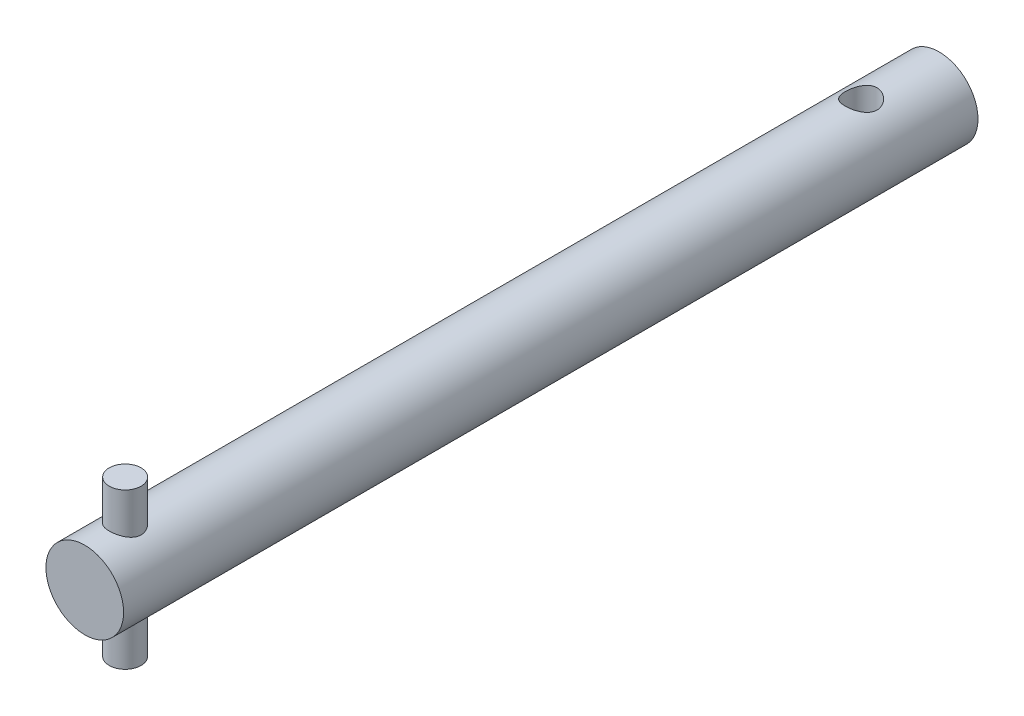
ISO-10303-21;
HEADER;
FILE_DESCRIPTION(('STEP AP214'),'2;1');
FILE_NAME('part.step','',(''),(''),'','','');
FILE_SCHEMA(('AUTOMOTIVE_DESIGN { 1 0 10303 214 1 1 1 1 }'));
ENDSEC;
DATA;
#1=APPLICATION_CONTEXT('core data for automotive mechanical design processes');
#2=APPLICATION_PROTOCOL_DEFINITION('international standard','automotive_design',2000,#1);
#3=PRODUCT_CONTEXT('',#1,'mechanical');
#4=PRODUCT('Part','Part','',(#3));
#5=PRODUCT_RELATED_PRODUCT_CATEGORY('part','',(#4));
#6=PRODUCT_DEFINITION_FORMATION('','',#4);
#7=PRODUCT_DEFINITION_CONTEXT('part definition',#1,'design');
#8=PRODUCT_DEFINITION('design','',#6,#7);
#9=PRODUCT_DEFINITION_SHAPE('','',#8);
#10=(LENGTH_UNIT() NAMED_UNIT(*) SI_UNIT(.MILLI.,.METRE.));
#11=(NAMED_UNIT(*) PLANE_ANGLE_UNIT() SI_UNIT($,.RADIAN.));
#12=(NAMED_UNIT(*) SI_UNIT($,.STERADIAN.) SOLID_ANGLE_UNIT());
#13=UNCERTAINTY_MEASURE_WITH_UNIT(LENGTH_MEASURE(1.E-05),#10,'distance_accuracy_value','');
#14=(GEOMETRIC_REPRESENTATION_CONTEXT(3) GLOBAL_UNCERTAINTY_ASSIGNED_CONTEXT((#13)) GLOBAL_UNIT_ASSIGNED_CONTEXT((#10,
#11,#12)) REPRESENTATION_CONTEXT('',''));
#15=CARTESIAN_POINT('',(0.,0.,0.));
#16=DIRECTION('',(0.,0.,1.));
#17=DIRECTION('',(1.,0.,0.));
#18=AXIS2_PLACEMENT_3D('',#15,#16,#17);
#19=CARTESIAN_POINT('',(0.,-20.,209.6));
#20=DIRECTION('',(0.,1.,0.));
#21=DIRECTION('',(0.,0.,1.));
#22=AXIS2_PLACEMENT_3D('',#19,#20,#21);
#23=CYLINDRICAL_SURFACE('',#22,4.09999999999999);
#24=CARTESIAN_POINT('',(0.,-20.,209.6));
#25=DIRECTION('',(0.,1.,0.));
#26=DIRECTION('',(0.,0.,1.));
#27=AXIS2_PLACEMENT_3D('',#24,#25,#26);
#28=CIRCLE('',#27,4.09999999999999);
#29=CARTESIAN_POINT('',(0.,-20.,213.7));
#30=VERTEX_POINT('',#29);
#31=EDGE_CURVE('E11',#30,#30,#28,.T.);
#32=ORIENTED_EDGE('',*,*,#31,.T.);
#33=EDGE_LOOP('',(#32));
#34=FACE_BOUND('',#33,.T.);
#35=CARTESIAN_POINT('',(0.,20.,209.6));
#36=DIRECTION('',(0.,1.,0.));
#37=DIRECTION('',(0.,0.,1.));
#38=AXIS2_PLACEMENT_3D('',#35,#36,#37);
#39=CIRCLE('',#38,4.09999999999999);
#40=CARTESIAN_POINT('',(0.,20.,213.7));
#41=VERTEX_POINT('',#40);
#42=EDGE_CURVE('E51',#41,#41,#39,.T.);
#43=ORIENTED_EDGE('',*,*,#42,.F.);
#44=EDGE_LOOP('',(#43));
#45=FACE_BOUND('',#44,.T.);
#46=ADVANCED_FACE('F45',(#34,#45),#23,.T.);
#47=CARTESIAN_POINT('',(0.,-20.,209.6));
#48=DIRECTION('',(0.,1.,0.));
#49=DIRECTION('',(0.,0.,1.));
#50=AXIS2_PLACEMENT_3D('',#47,#48,#49);
#51=PLANE('',#50);
#52=ORIENTED_EDGE('',*,*,#31,.F.);
#53=EDGE_LOOP('',(#52));
#54=FACE_BOUND('',#53,.T.);
#55=ADVANCED_FACE('F60',(#54),#51,.F.);
#56=CARTESIAN_POINT('',(0.,20.,209.6));
#57=DIRECTION('',(0.,1.,0.));
#58=DIRECTION('',(0.,0.,1.));
#59=AXIS2_PLACEMENT_3D('',#56,#57,#58);
#60=PLANE('',#59);
#61=ORIENTED_EDGE('',*,*,#42,.T.);
#62=EDGE_LOOP('',(#61));
#63=FACE_BOUND('',#62,.T.);
#64=ADVANCED_FACE('F57',(#63),#60,.T.);
#65=CLOSED_SHELL('',(#46,#55,#64));
#66=MANIFOLD_SOLID_BREP('B2',#65);
#67=CARTESIAN_POINT('',(0.,-1.11022302462516E-13,220.));
#68=DIRECTION('',(0.,0.,-1.));
#69=DIRECTION('',(-1.,0.,0.));
#70=AXIS2_PLACEMENT_3D('',#67,#68,#69);
#71=CYLINDRICAL_SURFACE('',#70,10.);
#72=CARTESIAN_POINT('',(0.,-10.,213.7));
#73=CARTESIAN_POINT('',(0.110007668732809,-9.99999942379567,213.69999926161));
#74=CARTESIAN_POINT('',(0.220054988478904,-9.99817960761471,213.695566248649));
#75=CARTESIAN_POINT('',(0.439366410277717,-9.99094652228085,213.677876320665));
#76=CARTESIAN_POINT('',(0.548629959334115,-9.98553092819759,213.664613696646));
#77=CARTESIAN_POINT('',(0.765755400161891,-9.97123211489997,213.629358822963));
#78=CARTESIAN_POINT('',(0.873613875429744,-9.96234165390743,213.607348340746));
#79=CARTESIAN_POINT('',(1.08693380274593,-9.9413327010413,213.554828046351));
#80=CARTESIAN_POINT('',(1.19239425608763,-9.92921289002551,213.524314760669));
#81=CARTESIAN_POINT('',(1.50329741822684,-9.88855374555773,213.420680225517));
#82=CARTESIAN_POINT('',(1.70423712669612,-9.8556463269752,213.335303412618));
#83=CARTESIAN_POINT('',(2.08865332920931,-9.78141001821997,213.134770997763));
#84=CARTESIAN_POINT('',(2.27213539766647,-9.74008382958069,213.019624945399));
#85=CARTESIAN_POINT('',(2.62580879886722,-9.65089874629261,212.756866165659));
#86=CARTESIAN_POINT('',(2.79503948848893,-9.60283041948107,212.608032299706));
#87=CARTESIAN_POINT('',(3.10701103752561,-9.50648143724177,212.284576905152));
#88=CARTESIAN_POINT('',(3.24973835496845,-9.45820068610163,212.109942274955));
#89=CARTESIAN_POINT('',(3.44426522745151,-9.38840255537039,211.827328129702));
#90=CARTESIAN_POINT('',(3.50701876973873,-9.36508038932406,211.727164508854));
#91=CARTESIAN_POINT('',(3.62380746819969,-9.3205107752373,211.52145466053));
#92=CARTESIAN_POINT('',(3.67784616776476,-9.29926248536838,211.415910643773));
#93=CARTESIAN_POINT('',(3.77674187996859,-9.25953912100863,211.200098290606));
#94=CARTESIAN_POINT('',(3.82159843195302,-9.24106418566515,211.089829717506));
#95=CARTESIAN_POINT('',(3.90166255463828,-9.20754659496636,210.865390734828));
#96=CARTESIAN_POINT('',(3.93687503412385,-9.19250219414143,210.751222343645));
#97=CARTESIAN_POINT('',(3.9958704079158,-9.16700629662939,210.525212273466));
#98=CARTESIAN_POINT('',(4.02010949068872,-9.15637342640527,210.413510129735));
#99=CARTESIAN_POINT('',(4.05919515609124,-9.13911335116285,210.188216102067));
#100=CARTESIAN_POINT('',(4.07404603888867,-9.13248431229317,210.074625107805));
#101=CARTESIAN_POINT('',(4.09418760517084,-9.12347250009092,209.846456813326));
#102=CARTESIAN_POINT('',(4.09948056998859,-9.12108871348159,209.73187975503));
#103=CARTESIAN_POINT('',(4.10044659531372,-9.12065447315865,209.502681548584));
#104=CARTESIAN_POINT('',(4.09612013835093,-9.12260380208712,209.388060402934));
#105=CARTESIAN_POINT('',(4.07857649864668,-9.13045992824223,209.168194861106));
#106=CARTESIAN_POINT('',(4.06604157482803,-9.13606290714635,209.062884771631));
#107=CARTESIAN_POINT('',(4.03291134125425,-9.15073456148362,208.853775182038));
#108=CARTESIAN_POINT('',(4.01231338845931,-9.15980437331257,208.749976188838));
#109=CARTESIAN_POINT('',(3.93870485151611,-9.19181971746231,208.441954446817));
#110=CARTESIAN_POINT('',(3.8738645638552,-9.2195784551596,208.240923164617));
#111=CARTESIAN_POINT('',(3.71328039262521,-9.28542712109565,207.848569730994));
#112=CARTESIAN_POINT('',(3.61691769214167,-9.32372125402804,207.657539119383));
#113=CARTESIAN_POINT('',(3.39644169708573,-9.40627581120766,207.293603377262));
#114=CARTESIAN_POINT('',(3.27231766126441,-9.45053854214957,207.12070530062));
#115=CARTESIAN_POINT('',(2.98795406810723,-9.54443785545721,206.783136047438));
#116=CARTESIAN_POINT('',(2.82559427398738,-9.59421825330542,206.620286743321));
#117=CARTESIAN_POINT('',(2.47535965100174,-9.69048779775721,206.323525320989));
#118=CARTESIAN_POINT('',(2.28747923080463,-9.73697621971453,206.189619560741));
#119=CARTESIAN_POINT('',(1.88615207259607,-9.82269704957375,205.951993562876));
#120=CARTESIAN_POINT('',(1.67223893521033,-9.86175006774089,205.848991574045));
#121=CARTESIAN_POINT('',(1.22811223659015,-9.92683156974756,205.681069497968));
#122=CARTESIAN_POINT('',(0.99790746343843,-9.95286701534867,205.616129052307));
#123=CARTESIAN_POINT('',(0.542970639598998,-9.98769220218834,205.529933427289));
#124=CARTESIAN_POINT('',(0.318775553924434,-9.99744582843961,205.506232784849));
#125=CARTESIAN_POINT('',(-0.130580777276464,-10.0016687207947,205.495927088334));
#126=CARTESIAN_POINT('',(-0.355741739402709,-9.99614219989587,205.509311809193));
#127=CARTESIAN_POINT('',(-0.789335598166546,-9.97105346913116,205.571026356622));
#128=CARTESIAN_POINT('',(-0.998054052575001,-9.95217353349491,205.61765835647));
#129=CARTESIAN_POINT('',(-1.40449144493457,-9.90299645178983,205.742202924269));
#130=CARTESIAN_POINT('',(-1.60220897934548,-9.87269785269928,205.820119473251));
#131=CARTESIAN_POINT('',(-1.98791933322146,-9.80243915194958,206.007565937328));
#132=CARTESIAN_POINT('',(-2.17542272920156,-9.76220938705181,206.117998489579));
#133=CARTESIAN_POINT('',(-2.52990690107349,-9.6764086994886,206.36635760286));
#134=CARTESIAN_POINT('',(-2.69687919054465,-9.63083558328137,206.504295471714));
#135=CARTESIAN_POINT('',(-3.01769453453923,-9.53537881978359,206.814898981451));
#136=CARTESIAN_POINT('',(-3.1698265400511,-9.4854152789938,206.989308514801));
#137=CARTESIAN_POINT('',(-3.4431649788808,-9.38965672661035,207.36215117522));
#138=CARTESIAN_POINT('',(-3.56436519846255,-9.34386255376736,207.560589117454));
#139=CARTESIAN_POINT('',(-3.72075962648743,-9.2821945375182,207.873775698942));
#140=CARTESIAN_POINT('',(-3.76889001193939,-9.26270347075246,207.981528982504));
#141=CARTESIAN_POINT('',(-3.85582088347273,-9.22685530606518,208.201223301377));
#142=CARTESIAN_POINT('',(-3.89462545467637,-9.21049683656684,208.313162478157));
#143=CARTESIAN_POINT('',(-3.96248027578092,-9.18150929486614,208.540374324066));
#144=CARTESIAN_POINT('',(-3.99153474770654,-9.16887860873128,208.655645526801));
#145=CARTESIAN_POINT('',(-4.03956904872027,-9.14781792239618,208.888645618362));
#146=CARTESIAN_POINT('',(-4.05854978270396,-9.13938754489818,209.006374285453));
#147=CARTESIAN_POINT('',(-4.08515211375237,-9.12752574179851,209.234355414812));
#148=CARTESIAN_POINT('',(-4.09352069056867,-9.1237660211122,209.344504195661));
#149=CARTESIAN_POINT('',(-4.10133990874788,-9.12025381450701,209.56522048781));
#150=CARTESIAN_POINT('',(-4.1007875616926,-9.12050267142052,209.675788127023));
#151=CARTESIAN_POINT('',(-4.09076222395259,-9.12500395642165,209.896384034903));
#152=CARTESIAN_POINT('',(-4.08129382771662,-9.12925432252747,210.006412552029));
#153=CARTESIAN_POINT('',(-4.05356196016496,-9.14160009935805,210.225150013322));
#154=CARTESIAN_POINT('',(-4.03529517383892,-9.14969695932844,210.333858444275));
#155=CARTESIAN_POINT('',(-3.96954781238333,-9.17850748268534,210.647274808126));
#156=CARTESIAN_POINT('',(-3.91061144074644,-9.20399636299515,210.849269755647));
#157=CARTESIAN_POINT('',(-3.76334149729218,-9.26517920811116,211.24044413479));
#158=CARTESIAN_POINT('',(-3.67499972037679,-9.30087602088203,211.429619971696));
#159=CARTESIAN_POINT('',(-3.4653920264463,-9.38106292063349,211.802122968797));
#160=CARTESIAN_POINT('',(-3.34249071273537,-9.42594762961904,211.984446047385));
#161=CARTESIAN_POINT('',(-3.06962571875099,-9.51830645643289,212.326792835827));
#162=CARTESIAN_POINT('',(-2.9196531414674,-9.56578142196297,212.486809183808));
#163=CARTESIAN_POINT('',(-2.58434486952391,-9.66196218121087,212.791531234237));
#164=CARTESIAN_POINT('',(-2.3972749313011,-9.71052386390146,212.934397566632));
#165=CARTESIAN_POINT('',(-2.09960427807814,-9.77763257348165,213.123572021777));
#166=CARTESIAN_POINT('',(-1.99744522049397,-9.79906179212933,213.182480813843));
#167=CARTESIAN_POINT('',(-1.78805531017716,-9.83942047506732,213.291444244485));
#168=CARTESIAN_POINT('',(-1.68082681920308,-9.85835108812636,213.341502955629));
#169=CARTESIAN_POINT('',(-1.46387782142195,-9.89287257063247,213.431530553507));
#170=CARTESIAN_POINT('',(-1.35423037364135,-9.90851461535684,213.471656097681));
#171=CARTESIAN_POINT('',(-1.13156178433277,-9.93640507095531,213.542487320185));
#172=CARTESIAN_POINT('',(-1.01854226470596,-9.9486550850856,213.573197449485));
#173=CARTESIAN_POINT('',(-0.790251734601282,-9.96938358340453,213.624818825994));
#174=CARTESIAN_POINT('',(-0.674987077293651,-9.97787144365381,213.645754440336));
#175=CARTESIAN_POINT('',(-0.442925113312001,-9.99086092366376,213.677685247012));
#176=CARTESIAN_POINT('',(-0.326129011555021,-9.99536550640742,213.688687828216));
#177=CARTESIAN_POINT('',(-0.174267574962155,-9.9985422751596,213.696443363731));
#178=CARTESIAN_POINT('',(-0.139430869289151,-9.99908865066459,213.697776766584));
#179=CARTESIAN_POINT('',(-0.0697307702130565,-9.99981760464276,213.699555202329));
#180=CARTESIAN_POINT('',(-0.034867376774405,-10.0000001826303,213.700000234036));
#181=CARTESIAN_POINT('',(0.,-10.,213.7));
#182=B_SPLINE_CURVE_WITH_KNOTS('',3,(#72,#73,#74,#75,#76,#77,#78,#79,#80,#81,#82,#83,#84,#85,
#86,#87,#88,#89,#90,#91,#92,#93,#94,#95,#96,#97,#98,#99,#100,#101,#102,#103,#104,#105,#106,#107,
#108,#109,#110,#111,#112,#113,#114,#115,#116,#117,#118,#119,#120,#121,#122,#123,#124,#125,#126,
#127,#128,#129,#130,#131,#132,#133,#134,#135,#136,#137,#138,#139,#140,#141,#142,#143,#144,#145,
#146,#147,#148,#149,#150,#151,#152,#153,#154,#155,#156,#157,#158,#159,#160,#161,#162,#163,#164,
#165,#166,#167,#168,#169,#170,#171,#172,#173,#174,#175,#176,#177,#178,#179,#180,#181),
.UNSPECIFIED.,.T.,.F.,(4,2,2,2,2,2,2,2,2,2,2,2,2,2,2,2,2,2,2,2,2,2,2,2,2,2,2,2,2,2,2,2,2,2,2,2,
2,2,2,2,2,2,2,2,2,2,2,2,2,2,2,2,2,2,4),(0.,0.329987197568171,0.660187963757892,0.99108058420211,
1.32210857720332,1.98122995645145,2.64014015978556,3.3285021746484,4.01721494798741,
4.37826845718779,4.73917479252577,5.10009922954851,5.46083961497195,5.80476791296669,
6.14853856380483,6.49222715084579,6.83589849815506,7.15411460119267,7.47243510210388,
8.10852937236309,8.7579463229887,9.40761497813448,10.1102842077799,10.8131076347612,
11.5311856113819,12.2488791500404,12.9223452463346,13.5956256750467,14.2367814997529,
14.8780189389202,15.5390749136656,16.2004032202497,16.9075490019215,17.6148367270535,
17.9732798157747,18.3315656030852,18.6896960433326,19.0477943082815,19.3789589742976,
19.7102345793878,20.0413395711992,20.3725694126806,21.0053844418792,21.6383761960052,
22.3087254406928,22.9792953990897,23.6965121218592,24.0557128195315,24.4147477900929,
24.7676963945602,25.1204778906549,25.4723751701606,25.8240104681994,25.9286011092248,
26.0331918898575),.UNSPECIFIED.);
#183=CARTESIAN_POINT('',(0.,-10.,213.7));
#184=VERTEX_POINT('',#183);
#185=EDGE_CURVE('E44',#184,#184,#182,.T.);
#186=ORIENTED_EDGE('',*,*,#185,.T.);
#187=EDGE_LOOP('',(#186));
#188=FACE_BOUND('',#187,.T.);
#189=CARTESIAN_POINT('',(0.,10.,213.7));
#190=CARTESIAN_POINT('',(-0.110007668732724,9.99999942379586,213.69999926161));
#191=CARTESIAN_POINT('',(-0.220054988478818,9.9981796076146,213.695566248649));
#192=CARTESIAN_POINT('',(-0.43936641027764,9.99094652228053,213.677876320665));
#193=CARTESIAN_POINT('',(-0.548629959334049,9.98553092819736,213.664613696646));
#194=CARTESIAN_POINT('',(-0.765755400161839,9.97123211489977,213.629358822963));
#195=CARTESIAN_POINT('',(-0.873613875429695,9.96234165390719,213.607348340746));
#196=CARTESIAN_POINT('',(-1.08693380274591,9.94133270104111,213.554828046351));
#197=CARTESIAN_POINT('',(-1.19239425608762,9.92921289002543,213.524314760669));
#198=CARTESIAN_POINT('',(-1.50329741822684,9.88855374555774,213.420680225517));
#199=CARTESIAN_POINT('',(-1.70423712669608,9.85564632697503,213.335303412618));
#200=CARTESIAN_POINT('',(-2.08865332920928,9.78141001821974,213.134770997763));
#201=CARTESIAN_POINT('',(-2.27213539766652,9.74008382958058,213.019624945399));
#202=CARTESIAN_POINT('',(-2.62580879886724,9.6508987462925,212.756866165659));
#203=CARTESIAN_POINT('',(-2.79503948848883,9.60283041948085,212.608032299706));
#204=CARTESIAN_POINT('',(-3.10701103752552,9.50648143724165,212.284576905152));
#205=CARTESIAN_POINT('',(-3.24973835496848,9.45820068610172,212.109942274955));
#206=CARTESIAN_POINT('',(-3.44426522745149,9.38840255537038,211.827328129703));
#207=CARTESIAN_POINT('',(-3.50701876973866,9.36508038932394,211.727164508854));
#208=CARTESIAN_POINT('',(-3.62380746819958,9.3205107752371,211.52145466053));
#209=CARTESIAN_POINT('',(-3.67784616776466,9.29926248536822,211.415910643773));
#210=CARTESIAN_POINT('',(-3.77674187996851,9.25953912100846,211.200098290606));
#211=CARTESIAN_POINT('',(-3.82159843195294,9.24106418566494,211.089829717506));
#212=CARTESIAN_POINT('',(-3.9016625546382,9.20754659496623,210.865390734828));
#213=CARTESIAN_POINT('',(-3.93687503412378,9.19250219414143,210.751222343645));
#214=CARTESIAN_POINT('',(-3.99587040791574,9.16700629662939,210.525212273466));
#215=CARTESIAN_POINT('',(-4.02010949068866,9.15637342640513,210.413510129735));
#216=CARTESIAN_POINT('',(-4.05919515609119,9.13911335116264,210.188216102067));
#217=CARTESIAN_POINT('',(-4.07404603888861,9.13248431229301,210.074625107805));
#218=CARTESIAN_POINT('',(-4.09418760517078,9.12347250009075,209.846456813326));
#219=CARTESIAN_POINT('',(-4.09948056998853,9.12108871348136,209.73187975503));
#220=CARTESIAN_POINT('',(-4.10044659531368,9.12065447315854,209.502681548584));
#221=CARTESIAN_POINT('',(-4.09612013835091,9.12260380208719,209.388060402934));
#222=CARTESIAN_POINT('',(-4.07857649864667,9.13045992824228,209.168194861106));
#223=CARTESIAN_POINT('',(-4.066041574828,9.13606290714624,209.062884771631));
#224=CARTESIAN_POINT('',(-4.03291134125421,9.15073456148337,208.853775182038));
#225=CARTESIAN_POINT('',(-4.01231338845927,9.15980437331234,208.749976188838));
#226=CARTESIAN_POINT('',(-3.9387048515161,9.19181971746221,208.441954446817));
#227=CARTESIAN_POINT('',(-3.87386456385524,9.21957845515968,208.240923164617));
#228=CARTESIAN_POINT('',(-3.71328039262525,9.28542712109569,207.848569730994));
#229=CARTESIAN_POINT('',(-3.61691769214164,9.32372125402785,207.657539119383));
#230=CARTESIAN_POINT('',(-3.39644169708569,9.40627581120747,207.293603377262));
#231=CARTESIAN_POINT('',(-3.27231766126444,9.45053854214962,207.12070530062));
#232=CARTESIAN_POINT('',(-2.98795406810727,9.54443785545727,206.783136047438));
#233=CARTESIAN_POINT('',(-2.82559427398736,9.59421825330521,206.620286743321));
#234=CARTESIAN_POINT('',(-2.47535965100168,9.69048779775703,206.323525320989));
#235=CARTESIAN_POINT('',(-2.28747923080459,9.73697621971464,206.189619560741));
#236=CARTESIAN_POINT('',(-1.88615207259603,9.82269704957386,205.951993562876));
#237=CARTESIAN_POINT('',(-1.67223893521026,9.86175006774069,205.848991574045));
#238=CARTESIAN_POINT('',(-1.22811223659006,9.92683156974735,205.681069497968));
#239=CARTESIAN_POINT('',(-0.99790746343836,9.95286701534877,205.616129052307));
#240=CARTESIAN_POINT('',(-0.542970639598941,9.98769220218841,205.529933427289));
#241=CARTESIAN_POINT('',(-0.318775553924377,9.99744582843938,205.506232784849));
#242=CARTESIAN_POINT('',(0.130580777276523,10.0016687207945,205.495927088334));
#243=CARTESIAN_POINT('',(0.355741739402771,9.996142199896,205.509311809193));
#244=CARTESIAN_POINT('',(0.789335598166593,9.97105346913125,205.571026356622));
#245=CARTESIAN_POINT('',(0.998054052575033,9.95217353349466,205.61765835647));
#246=CARTESIAN_POINT('',(1.40449144493461,9.9029964517896,205.742202924269));
#247=CARTESIAN_POINT('',(1.60220897934555,9.87269785269941,205.820119473251));
#248=CARTESIAN_POINT('',(1.98791933322151,9.80243915194972,206.007565937328));
#249=CARTESIAN_POINT('',(2.17542272920155,9.7622093870516,206.117998489579));
#250=CARTESIAN_POINT('',(2.52990690107344,9.67640869948835,206.36635760286));
#251=CARTESIAN_POINT('',(2.69687919054462,9.63083558328147,206.504295471714));
#252=CARTESIAN_POINT('',(3.01769453453922,9.53537881978371,206.814898981451));
#253=CARTESIAN_POINT('',(3.16982654005109,9.48541527899356,206.989308514801));
#254=CARTESIAN_POINT('',(3.44316497888078,9.38965672661012,207.36215117522));
#255=CARTESIAN_POINT('',(3.56436519846252,9.34386255376753,207.560589117454));
#256=CARTESIAN_POINT('',(3.72075962648743,9.2821945375182,207.873775698942));
#257=CARTESIAN_POINT('',(3.76889001193941,9.26270347075226,207.981528982504));
#258=CARTESIAN_POINT('',(3.85582088347277,9.22685530606486,208.201223301377));
#259=CARTESIAN_POINT('',(3.8946254546764,9.21049683656658,208.313162478157));
#260=CARTESIAN_POINT('',(3.96248027578096,9.18150929486587,208.540374324066));
#261=CARTESIAN_POINT('',(3.9915347477066,9.16887860873095,208.655645526801));
#262=CARTESIAN_POINT('',(4.03956904872031,9.14781792239597,208.888645618362));
#263=CARTESIAN_POINT('',(4.05854978270396,9.13938754489816,209.006374285453));
#264=CARTESIAN_POINT('',(4.08515211375237,9.12752574179847,209.234355414812));
#265=CARTESIAN_POINT('',(4.09352069056871,9.12376602111198,209.344504195661));
#266=CARTESIAN_POINT('',(4.10133990874795,9.12025381450668,209.56522048781));
#267=CARTESIAN_POINT('',(4.10078756169266,9.12050267142025,209.675788127023));
#268=CARTESIAN_POINT('',(4.09076222395264,9.12500395642138,209.896384034903));
#269=CARTESIAN_POINT('',(4.08129382771666,9.12925432252713,210.006412552029));
#270=CARTESIAN_POINT('',(4.05356196016502,9.14160009935785,210.225150013322));
#271=CARTESIAN_POINT('',(4.03529517383901,9.14969695932843,210.333858444275));
#272=CARTESIAN_POINT('',(3.96954781238345,9.17850748268551,210.647274808126));
#273=CARTESIAN_POINT('',(3.91061144074652,9.20399636299493,210.849269755648));
#274=CARTESIAN_POINT('',(3.76334149729218,9.26517920811085,211.24044413479));
#275=CARTESIAN_POINT('',(3.67499972037675,9.30087602088203,211.429619971696));
#276=CARTESIAN_POINT('',(3.46539202644624,9.38106292063355,211.802122968797));
#277=CARTESIAN_POINT('',(3.34249071273535,9.42594762961883,211.984446047385));
#278=CARTESIAN_POINT('',(3.069625718751,9.51830645643262,212.326792835827));
#279=CARTESIAN_POINT('',(2.91965314146741,9.5657814219629,212.486809183808));
#280=CARTESIAN_POINT('',(2.58434486952391,9.66196218121089,212.791531234237));
#281=CARTESIAN_POINT('',(2.39727493130109,9.71052386390132,212.934397566632));
#282=CARTESIAN_POINT('',(2.09960427807812,9.77763257348137,213.123572021777));
#283=CARTESIAN_POINT('',(1.99744522049395,9.79906179212903,213.182480813843));
#284=CARTESIAN_POINT('',(1.78805531017716,9.83942047506716,213.291444244485));
#285=CARTESIAN_POINT('',(1.6808268192031,9.85835108812637,213.341502955629));
#286=CARTESIAN_POINT('',(1.46387782142197,9.89287257063247,213.431530553507));
#287=CARTESIAN_POINT('',(1.35423037364134,9.90851461535667,213.471656097681));
#288=CARTESIAN_POINT('',(1.13156178433276,9.93640507095503,213.542487320185));
#289=CARTESIAN_POINT('',(1.01854226470596,9.94865508508538,213.573197449485));
#290=CARTESIAN_POINT('',(0.79025173460129,9.96938358340429,213.624818825994));
#291=CARTESIAN_POINT('',(0.674987077293655,9.97787144365349,213.645754440336));
#292=CARTESIAN_POINT('',(0.442925113312013,9.99086092366364,213.677685247012));
#293=CARTESIAN_POINT('',(0.326129011555045,9.99536550640759,213.688687828216));
#294=CARTESIAN_POINT('',(0.174267574962191,9.99854227515948,213.696443363731));
#295=CARTESIAN_POINT('',(0.139430869289195,9.99908865066436,213.697776766584));
#296=CARTESIAN_POINT('',(0.0697307702131182,9.99981760464254,213.699555202329));
#297=CARTESIAN_POINT('',(0.0348673767744776,10.0000001826303,213.700000234036));
#298=CARTESIAN_POINT('',(0.,10.,213.7));
#299=B_SPLINE_CURVE_WITH_KNOTS('',3,(#189,#190,#191,#192,#193,#194,#195,#196,#197,#198,#199,
#200,#201,#202,#203,#204,#205,#206,#207,#208,#209,#210,#211,#212,#213,#214,#215,#216,#217,#218,
#219,#220,#221,#222,#223,#224,#225,#226,#227,#228,#229,#230,#231,#232,#233,#234,#235,#236,#237,
#238,#239,#240,#241,#242,#243,#244,#245,#246,#247,#248,#249,#250,#251,#252,#253,#254,#255,#256,
#257,#258,#259,#260,#261,#262,#263,#264,#265,#266,#267,#268,#269,#270,#271,#272,#273,#274,#275,
#276,#277,#278,#279,#280,#281,#282,#283,#284,#285,#286,#287,#288,#289,#290,#291,#292,#293,#294,
#295,#296,#297,#298),.UNSPECIFIED.,.T.,.F.,(4,2,2,2,2,2,2,2,2,2,2,2,2,2,2,2,2,2,2,2,2,2,2,2,2,2,
2,2,2,2,2,2,2,2,2,2,2,2,2,2,2,2,2,2,2,2,2,2,2,2,2,2,2,2,4),(0.,0.329987197568171,
0.66018796375792,0.991080584202158,1.32210857720338,1.98122995645153,2.6401401597856,
3.32850217464841,4.01721494798736,4.37826845718778,4.73917479252577,5.10009922954848,
5.46083961497198,5.80476791296674,6.14853856380483,6.49222715084576,6.835898498155,
7.15411460119261,7.47243510210381,8.10852937236303,8.75794632298871,9.40761497813453,
10.1102842077799,10.8131076347612,11.531185611382,12.2488791500404,12.9223452463347,
13.5956256750467,14.236781499753,14.8780189389203,15.5390749136656,16.2004032202496,
16.9075490019215,17.6148367270535,17.9732798157748,18.3315656030852,18.6896960433326,
19.0477943082816,19.3789589742977,19.7102345793878,20.0413395711992,20.3725694126806,
21.0053844418792,21.6383761960053,22.3087254406929,22.9792953990898,23.6965121218593,
24.0557128195316,24.414747790093,24.7676963945603,25.120477890655,25.4723751701607,
25.8240104681994,25.9286011092248,26.0331918898575),.UNSPECIFIED.);
#300=CARTESIAN_POINT('',(0.,10.,213.7));
#301=VERTEX_POINT('',#300);
#302=EDGE_CURVE('E95',#301,#301,#299,.T.);
#303=ORIENTED_EDGE('',*,*,#302,.T.);
#304=EDGE_LOOP('',(#303));
#305=FACE_BOUND('',#304,.T.);
#306=CARTESIAN_POINT('',(0.,-9.99999999999995,24.2));
#307=CARTESIAN_POINT('',(0.110007668732812,-9.99999942379549,24.1999992616096));
#308=CARTESIAN_POINT('',(0.22005498847891,-9.99817960761466,24.1955662486488));
#309=CARTESIAN_POINT('',(0.439366410277723,-9.9909465222809,24.1778763206653));
#310=CARTESIAN_POINT('',(0.548629959334119,-9.9855309281976,24.1646136966458));
#311=CARTESIAN_POINT('',(0.765755400161898,-9.97123211489996,24.1293588229626));
#312=CARTESIAN_POINT('',(0.873613875429754,-9.96234165390745,24.1073483407458));
#313=CARTESIAN_POINT('',(1.08693380274594,-9.94133270104128,24.0548280463512));
#314=CARTESIAN_POINT('',(1.19239425608763,-9.92921289002543,24.0243147606688));
#315=CARTESIAN_POINT('',(1.50329741822682,-9.88855374555757,23.9206802255173));
#316=CARTESIAN_POINT('',(1.7042371266961,-9.85564632697516,23.8353034126181));
#317=CARTESIAN_POINT('',(2.0886533292093,-9.78141001822002,23.6347709977634));
#318=CARTESIAN_POINT('',(2.27213539766648,-9.74008382958071,23.5196249453988));
#319=CARTESIAN_POINT('',(2.62580879886722,-9.65089874629259,23.2568661656587));
#320=CARTESIAN_POINT('',(2.79503948848891,-9.60283041948105,23.1080322997062));
#321=CARTESIAN_POINT('',(3.10701103752557,-9.50648143724182,22.7845769051516));
#322=CARTESIAN_POINT('',(3.24973835496841,-9.45820068610174,22.6099422749549));
#323=CARTESIAN_POINT('',(3.44426522745149,-9.38840255537045,22.3273281297024));
#324=CARTESIAN_POINT('',(3.50701876973873,-9.36508038932408,22.2271645088541));
#325=CARTESIAN_POINT('',(3.62380746819968,-9.32051077523729,22.0214546605298));
#326=CARTESIAN_POINT('',(3.67784616776475,-9.29926248536838,21.9159106437733));
#327=CARTESIAN_POINT('',(3.77674187996858,-9.25953912100863,21.7000982906057));
#328=CARTESIAN_POINT('',(3.82159843195303,-9.24106418566514,21.5898297175063));
#329=CARTESIAN_POINT('',(3.90166255463826,-9.20754659496638,21.3653907348278));
#330=CARTESIAN_POINT('',(3.93687503412378,-9.19250219414151,21.2512223436453));
#331=CARTESIAN_POINT('',(3.99587040791574,-9.16700629662947,21.025212273466));
#332=CARTESIAN_POINT('',(4.02010949068871,-9.15637342640528,20.9135101297345));
#333=CARTESIAN_POINT('',(4.05919515609127,-9.13911335116283,20.6882161020673));
#334=CARTESIAN_POINT('',(4.07404603888868,-9.13248431229317,20.574625107805));
#335=CARTESIAN_POINT('',(4.09418760517084,-9.12347250009092,20.3464568133258));
#336=CARTESIAN_POINT('',(4.09948056998859,-9.12108871348157,20.2318797550297));
#337=CARTESIAN_POINT('',(4.10044659531374,-9.12065447315866,20.0026815485839));
#338=CARTESIAN_POINT('',(4.09612013835095,-9.12260380208718,19.8880604029342));
#339=CARTESIAN_POINT('',(4.0785764986467,-9.13045992824228,19.6681948611061));
#340=CARTESIAN_POINT('',(4.06604157482804,-9.13606290714636,19.5628847716307));
#341=CARTESIAN_POINT('',(4.03291134125425,-9.1507345614836,19.3537751820379));
#342=CARTESIAN_POINT('',(4.01231338845932,-9.15980437331256,19.2499761888377));
#343=CARTESIAN_POINT('',(3.93870485151613,-9.19181971746233,18.9419544468166));
#344=CARTESIAN_POINT('',(3.87386456385523,-9.21957845515964,18.740923164617));
#345=CARTESIAN_POINT('',(3.71328039262523,-9.28542712109568,18.3485697309943));
#346=CARTESIAN_POINT('',(3.61691769214165,-9.32372125402803,18.1575391193831));
#347=CARTESIAN_POINT('',(3.3964416970857,-9.40627581120769,17.7936033772617));
#348=CARTESIAN_POINT('',(3.27231766126441,-9.45053854214969,17.62070530062));
#349=CARTESIAN_POINT('',(2.98795406810723,-9.54443785545732,17.2831360474379));
#350=CARTESIAN_POINT('',(2.82559427398734,-9.59421825330544,17.1202867433211));
#351=CARTESIAN_POINT('',(2.47535965100168,-9.69048779775722,16.8235253209894));
#352=CARTESIAN_POINT('',(2.28747923080458,-9.73697621971462,16.6896195607411));
#353=CARTESIAN_POINT('',(1.88615207259603,-9.82269704957383,16.4519935628756));
#354=CARTESIAN_POINT('',(1.67223893521028,-9.86175006774088,16.3489915740454));
#355=CARTESIAN_POINT('',(1.22811223659012,-9.92683156974758,16.1810694979683));
#356=CARTESIAN_POINT('',(0.997907463438427,-9.95286701534881,16.116129052307));
#357=CARTESIAN_POINT('',(0.542970639599019,-9.98769220218848,16.0299334272888));
#358=CARTESIAN_POINT('',(0.318775553924457,-9.99744582843964,16.006232784849));
#359=CARTESIAN_POINT('',(-0.13058077727644,-10.0016687207946,15.9959270883337));
#360=CARTESIAN_POINT('',(-0.355741739402684,-9.9961421998959,16.0093118091927));
#361=CARTESIAN_POINT('',(-0.789335598166532,-9.97105346913118,16.0710263566221));
#362=CARTESIAN_POINT('',(-0.998054052574998,-9.95217353349488,16.1176583564702));
#363=CARTESIAN_POINT('',(-1.4044914449346,-9.90299645178985,16.2422029242686));
#364=CARTESIAN_POINT('',(-1.60220897934554,-9.8726978526994,16.3201194732514));
#365=CARTESIAN_POINT('',(-1.98791933322151,-9.80243915194968,16.5075659373278));
#366=CARTESIAN_POINT('',(-2.17542272920158,-9.76220938705181,16.617998489579));
#367=CARTESIAN_POINT('',(-2.52990690107349,-9.67640869948859,16.8663576028604));
#368=CARTESIAN_POINT('',(-2.69687919054468,-9.63083558328147,17.0042954717143));
#369=CARTESIAN_POINT('',(-3.01769453453926,-9.53537881978371,17.3148989814512));
#370=CARTESIAN_POINT('',(-3.16982654005111,-9.48541527899383,17.4893085148008));
#371=CARTESIAN_POINT('',(-3.44316497888078,-9.38965672661032,17.8621511752201));
#372=CARTESIAN_POINT('',(-3.56436519846254,-9.3438625537674,18.0605891174536));
#373=CARTESIAN_POINT('',(-3.72075962648742,-9.28219453751822,18.3737756989422));
#374=CARTESIAN_POINT('',(-3.76889001193939,-9.26270347075246,18.4815289825044));
#375=CARTESIAN_POINT('',(-3.85582088347273,-9.22685530606518,18.7012233013774));
#376=CARTESIAN_POINT('',(-3.89462545467637,-9.21049683656684,18.8131624781573));
#377=CARTESIAN_POINT('',(-3.96248027578092,-9.18150929486614,19.0403743240659));
#378=CARTESIAN_POINT('',(-3.99153474770654,-9.16887860873127,19.155645526801));
#379=CARTESIAN_POINT('',(-4.03956904872027,-9.14781792239619,19.3886456183618));
#380=CARTESIAN_POINT('',(-4.05854978270396,-9.13938754489821,19.5063742854526));
#381=CARTESIAN_POINT('',(-4.08515211375237,-9.12752574179853,19.7343554148125));
#382=CARTESIAN_POINT('',(-4.09352069056867,-9.1237660211122,19.844504195661));
#383=CARTESIAN_POINT('',(-4.10133990874788,-9.120253814507,20.0652204878105));
#384=CARTESIAN_POINT('',(-4.10078756169261,-9.12050267142052,20.1757881270234));
#385=CARTESIAN_POINT('',(-4.09076222395259,-9.12500395642165,20.3963840349031));
#386=CARTESIAN_POINT('',(-4.08129382771661,-9.12925432252745,20.5064125520285));
#387=CARTESIAN_POINT('',(-4.05356196016498,-9.14160009935806,20.7251500133219));
#388=CARTESIAN_POINT('',(-4.03529517383898,-9.14969695932848,20.833858444275));
#389=CARTESIAN_POINT('',(-3.96954781238345,-9.17850748268542,21.1472748081258));
#390=CARTESIAN_POINT('',(-3.91061144074648,-9.20399636299515,21.3492697556475));
#391=CARTESIAN_POINT('',(-3.76334149729214,-9.26517920811116,21.7404441347904));
#392=CARTESIAN_POINT('',(-3.67499972037675,-9.3008760208821,21.9296199716955));
#393=CARTESIAN_POINT('',(-3.46539202644628,-9.38106292063358,22.3021229687966));
#394=CARTESIAN_POINT('',(-3.3424907127354,-9.42594762961908,22.4844460473847));
#395=CARTESIAN_POINT('',(-3.06962571875101,-9.51830645643284,22.826792835827));
#396=CARTESIAN_POINT('',(-2.91965314146739,-9.56578142196288,22.9868091838082));
#397=CARTESIAN_POINT('',(-2.5843448695239,-9.6619621812108,23.2915312342365));
#398=CARTESIAN_POINT('',(-2.39727493130114,-9.71052386390144,23.4343975666322));
#399=CARTESIAN_POINT('',(-2.09960427807821,-9.77763257348164,23.6235720217767));
#400=CARTESIAN_POINT('',(-1.99744522049404,-9.79906179212932,23.6824808138426));
#401=CARTESIAN_POINT('',(-1.78805531017721,-9.83942047506731,23.7914442444853));
#402=CARTESIAN_POINT('',(-1.68082681920309,-9.85835108812636,23.8415029556291));
#403=CARTESIAN_POINT('',(-1.46387782142195,-9.89287257063248,23.9315305535071));
#404=CARTESIAN_POINT('',(-1.35423037364136,-9.90851461535685,23.9716560976809));
#405=CARTESIAN_POINT('',(-1.13156178433279,-9.93640507095531,24.0424873201849));
#406=CARTESIAN_POINT('',(-1.01854226470598,-9.94865508508558,24.0731974494853));
#407=CARTESIAN_POINT('',(-0.790251734601293,-9.96938358340454,24.124818825994));
#408=CARTESIAN_POINT('',(-0.674987077293662,-9.97787144365386,24.1457544403361));
#409=CARTESIAN_POINT('',(-0.442925113312003,-9.99086092366371,24.1776852470123));
#410=CARTESIAN_POINT('',(-0.326129011555012,-9.99536550640724,24.1886878282159));
#411=CARTESIAN_POINT('',(-0.174267574962143,-9.99854227515955,24.1964433637311));
#412=CARTESIAN_POINT('',(-0.139430869289143,-9.99908865066459,24.1977767665838));
#413=CARTESIAN_POINT('',(-0.0697307702130528,-9.99981760464276,24.1995552023291));
#414=CARTESIAN_POINT('',(-0.0348673767744031,-10.0000001826303,24.2000002340358));
#415=CARTESIAN_POINT('',(0.,-9.99999999999995,24.2));
#416=B_SPLINE_CURVE_WITH_KNOTS('',3,(#306,#307,#308,#309,#310,#311,#312,#313,#314,#315,#316,
#317,#318,#319,#320,#321,#322,#323,#324,#325,#326,#327,#328,#329,#330,#331,#332,#333,#334,#335,
#336,#337,#338,#339,#340,#341,#342,#343,#344,#345,#346,#347,#348,#349,#350,#351,#352,#353,#354,
#355,#356,#357,#358,#359,#360,#361,#362,#363,#364,#365,#366,#367,#368,#369,#370,#371,#372,#373,
#374,#375,#376,#377,#378,#379,#380,#381,#382,#383,#384,#385,#386,#387,#388,#389,#390,#391,#392,
#393,#394,#395,#396,#397,#398,#399,#400,#401,#402,#403,#404,#405,#406,#407,#408,#409,#410,#411,
#412,#413,#414,#415),.UNSPECIFIED.,.T.,.F.,(4,2,2,2,2,2,2,2,2,2,2,2,2,2,2,2,2,2,2,2,2,2,2,2,2,2,
2,2,2,2,2,2,2,2,2,2,2,2,2,2,2,2,2,2,2,2,2,2,2,2,2,2,2,2,4),(0.,0.329987197568177,
0.660187963757895,0.991080584202115,1.32210857720333,1.98122995645144,2.64014015978549,
3.32850217464837,4.01721494798738,4.37826845718778,4.73917479252576,5.10009922954846,
5.46083961497192,5.80476791296673,6.14853856380482,6.49222715084577,6.83589849815506,
7.15411460119264,7.47243510210385,8.10852937236308,8.75794632298877,9.4076149781346,
10.11028420778,10.8131076347613,11.531185611382,12.2488791500404,12.9223452463346,
13.5956256750467,14.2367814997529,14.8780189389203,15.5390749136657,16.2004032202497,
16.9075490019215,17.6148367270535,17.9732798157748,18.3315656030852,18.6896960433326,
19.0477943082816,19.3789589742977,19.7102345793878,20.0413395711992,20.3725694126806,
21.0053844418792,21.6383761960052,22.3087254406928,22.9792953990896,23.6965121218592,
24.0557128195314,24.4147477900928,24.7676963945602,25.1204778906549,25.4723751701606,
25.8240104681994,25.9286011092248,26.0331918898575),.UNSPECIFIED.);
#417=CARTESIAN_POINT('',(0.,-9.99999999999995,24.2));
#418=VERTEX_POINT('',#417);
#419=EDGE_CURVE('E99',#418,#418,#416,.T.);
#420=ORIENTED_EDGE('',*,*,#419,.T.);
#421=EDGE_LOOP('',(#420));
#422=FACE_BOUND('',#421,.T.);
#423=CARTESIAN_POINT('',(0.,10.0000000000001,24.2));
#424=CARTESIAN_POINT('',(-0.110007668732718,9.99999942379603,24.1999992616096));
#425=CARTESIAN_POINT('',(-0.220054988478807,9.99817960761464,24.1955662486488));
#426=CARTESIAN_POINT('',(-0.439366410277623,9.99094652228049,24.1778763206653));
#427=CARTESIAN_POINT('',(-0.548629959334031,9.98553092819735,24.1646136966458));
#428=CARTESIAN_POINT('',(-0.765755400161817,9.97123211489978,24.1293588229626));
#429=CARTESIAN_POINT('',(-0.873613875429671,9.96234165390718,24.1073483407458));
#430=CARTESIAN_POINT('',(-1.08693380274588,9.94133270104112,24.0548280463512));
#431=CARTESIAN_POINT('',(-1.19239425608759,9.92921289002547,24.0243147606688));
#432=CARTESIAN_POINT('',(-1.50329741822681,9.88855374555781,23.9206802255173));
#433=CARTESIAN_POINT('',(-1.70423712669604,9.85564632697503,23.8353034126181));
#434=CARTESIAN_POINT('',(-2.08865332920925,9.78141001821976,23.6347709977634));
#435=CARTESIAN_POINT('',(-2.27213539766649,9.74008382958069,23.5196249453988));
#436=CARTESIAN_POINT('',(-2.62580879886723,9.65089874629266,23.2568661656587));
#437=CARTESIAN_POINT('',(-2.79503948848884,9.60283041948095,23.1080322997062));
#438=CARTESIAN_POINT('',(-3.10701103752552,9.50648143724155,22.7845769051517));
#439=CARTESIAN_POINT('',(-3.24973835496846,9.45820068610149,22.609942274955));
#440=CARTESIAN_POINT('',(-3.44426522745149,9.38840255537025,22.3273281297025));
#441=CARTESIAN_POINT('',(-3.50701876973867,9.3650803893239,22.2271645088541));
#442=CARTESIAN_POINT('',(-3.6238074681996,9.32051077523712,22.0214546605298));
#443=CARTESIAN_POINT('',(-3.67784616776469,9.29926248536821,21.9159106437733));
#444=CARTESIAN_POINT('',(-3.77674187996853,9.25953912100845,21.7000982906057));
#445=CARTESIAN_POINT('',(-3.82159843195296,9.24106418566496,21.5898297175062));
#446=CARTESIAN_POINT('',(-3.90166255463824,9.20754659496619,21.3653907348278));
#447=CARTESIAN_POINT('',(-3.93687503412384,9.19250219414132,21.2512223436453));
#448=CARTESIAN_POINT('',(-3.99587040791579,9.16700629662928,21.025212273466));
#449=CARTESIAN_POINT('',(-4.02010949068868,9.1563734264051,20.9135101297345));
#450=CARTESIAN_POINT('',(-4.05919515609118,9.13911335116266,20.6882161020673));
#451=CARTESIAN_POINT('',(-4.07404603888861,9.13248431229301,20.5746251078051));
#452=CARTESIAN_POINT('',(-4.09418760517079,9.12347250009074,20.3464568133259));
#453=CARTESIAN_POINT('',(-4.09948056998853,9.12108871348138,20.2318797550297));
#454=CARTESIAN_POINT('',(-4.10044659531368,9.12065447315852,20.002681548584));
#455=CARTESIAN_POINT('',(-4.09612013835089,9.1226038020871,19.8880604029343));
#456=CARTESIAN_POINT('',(-4.07857649864665,9.1304599282422,19.6681948611062));
#457=CARTESIAN_POINT('',(-4.066041574828,9.13606290714621,19.5628847716308));
#458=CARTESIAN_POINT('',(-4.03291134125422,9.15073456148339,19.353775182038));
#459=CARTESIAN_POINT('',(-4.01231338845928,9.15980437331235,19.2499761888378));
#460=CARTESIAN_POINT('',(-3.9387048515161,9.19181971746219,18.9419544468167));
#461=CARTESIAN_POINT('',(-3.87386456385523,9.21957845515962,18.7409231646171));
#462=CARTESIAN_POINT('',(-3.71328039262524,9.28542712109564,18.3485697309944));
#463=CARTESIAN_POINT('',(-3.61691769214165,9.32372125402785,18.1575391193832));
#464=CARTESIAN_POINT('',(-3.3964416970857,9.40627581120747,17.7936033772617));
#465=CARTESIAN_POINT('',(-3.27231766126443,9.45053854214957,17.6207053006201));
#466=CARTESIAN_POINT('',(-2.98795406810726,9.54443785545721,17.2831360474381));
#467=CARTESIAN_POINT('',(-2.82559427398737,9.5942182533052,17.1202867433212));
#468=CARTESIAN_POINT('',(-2.47535965100172,9.69048779775703,16.8235253209895));
#469=CARTESIAN_POINT('',(-2.28747923080464,9.73697621971459,16.6896195607412));
#470=CARTESIAN_POINT('',(-1.88615207259608,9.82269704957381,16.4519935628757));
#471=CARTESIAN_POINT('',(-1.67223893521029,9.86175006774067,16.3489915740454));
#472=CARTESIAN_POINT('',(-1.22811223659008,9.92683156974736,16.1810694979683));
#473=CARTESIAN_POINT('',(-0.997907463438369,9.95286701534877,16.116129052307));
#474=CARTESIAN_POINT('',(-0.542970639598942,9.98769220218842,16.0299334272888));
#475=CARTESIAN_POINT('',(-0.318775553924377,9.99744582843941,16.006232784849));
#476=CARTESIAN_POINT('',(0.130580777276516,10.0016687207944,15.9959270883338));
#477=CARTESIAN_POINT('',(0.355741739402755,9.99614219989587,16.0093118091928));
#478=CARTESIAN_POINT('',(0.789335598166579,9.97105346913115,16.0710263566222));
#479=CARTESIAN_POINT('',(0.998054052575026,9.95217353349467,16.1176583564702));
#480=CARTESIAN_POINT('',(1.40449144493458,9.9029964517896,16.2422029242685));
#481=CARTESIAN_POINT('',(1.6022089793455,9.87269785269931,16.3201194732514));
#482=CARTESIAN_POINT('',(1.98791933322146,9.8024391519496,16.5075659373278));
#483=CARTESIAN_POINT('',(2.17542272920154,9.76220938705158,16.6179984895789));
#484=CARTESIAN_POINT('',(2.52990690107346,9.67640869948837,16.8663576028603));
#485=CARTESIAN_POINT('',(2.69687919054465,9.63083558328142,17.0042954717143));
#486=CARTESIAN_POINT('',(3.01769453453924,9.53537881978365,17.3148989814512));
#487=CARTESIAN_POINT('',(3.16982654005111,9.48541527899357,17.4893085148007));
#488=CARTESIAN_POINT('',(3.44316497888079,9.3896567266101,17.86215117522));
#489=CARTESIAN_POINT('',(3.56436519846252,9.34386255376742,18.0605891174536));
#490=CARTESIAN_POINT('',(3.72075962648743,9.28219453751813,18.3737756989422));
#491=CARTESIAN_POINT('',(3.76889001193942,9.26270347075224,18.4815289825043));
#492=CARTESIAN_POINT('',(3.85582088347278,9.22685530606487,18.7012233013773));
#493=CARTESIAN_POINT('',(3.89462545467641,9.21049683656658,18.8131624781572));
#494=CARTESIAN_POINT('',(3.96248027578097,9.18150929486587,19.0403743240659));
#495=CARTESIAN_POINT('',(3.99153474770659,9.16887860873095,19.155645526801));
#496=CARTESIAN_POINT('',(4.03956904872032,9.14781792239596,19.3886456183617));
#497=CARTESIAN_POINT('',(4.058549782704,9.13938754489813,19.5063742854526));
#498=CARTESIAN_POINT('',(4.08515211375241,9.12752574179844,19.7343554148125));
#499=CARTESIAN_POINT('',(4.09352069056872,9.12376602111198,19.8445041956611));
#500=CARTESIAN_POINT('',(4.10133990874794,9.12025381450668,20.0652204878105));
#501=CARTESIAN_POINT('',(4.10078756169266,9.12050267142025,20.1757881270235));
#502=CARTESIAN_POINT('',(4.09076222395265,9.12500395642138,20.3963840349031));
#503=CARTESIAN_POINT('',(4.08129382771669,9.12925432252715,20.5064125520285));
#504=CARTESIAN_POINT('',(4.05356196016501,9.14160009935782,20.7251500133219));
#505=CARTESIAN_POINT('',(4.03529517383893,9.14969695932834,20.833858444275));
#506=CARTESIAN_POINT('',(3.96954781238331,9.17850748268537,21.1472748081258));
#507=CARTESIAN_POINT('',(3.91061144074648,9.20399636299492,21.3492697556475));
#508=CARTESIAN_POINT('',(3.76334149729221,9.26517920811088,21.7404441347904));
#509=CARTESIAN_POINT('',(3.67499972037674,9.30087602088196,21.9296199716956));
#510=CARTESIAN_POINT('',(3.46539202644622,9.38106292063345,22.3021229687966));
#511=CARTESIAN_POINT('',(3.34249071273536,9.4259476296188,22.4844460473848));
#512=CARTESIAN_POINT('',(3.06962571875102,9.51830645643265,22.8267928358271));
#513=CARTESIAN_POINT('',(2.91965314146742,9.56578142196291,22.9868091838083));
#514=CARTESIAN_POINT('',(2.58434486952391,9.66196218121088,23.2915312342366));
#515=CARTESIAN_POINT('',(2.3972749313011,9.71052386390133,23.4343975666323));
#516=CARTESIAN_POINT('',(2.09960427807812,9.77763257348136,23.6235720217768));
#517=CARTESIAN_POINT('',(1.99744522049394,9.79906179212901,23.6824808138427));
#518=CARTESIAN_POINT('',(1.78805531017715,9.83942047506718,23.7914442444854));
#519=CARTESIAN_POINT('',(1.6808268192031,9.85835108812645,23.8415029556292));
#520=CARTESIAN_POINT('',(1.46387782142197,9.89287257063255,23.9315305535072));
#521=CARTESIAN_POINT('',(1.35423037364134,9.90851461535669,23.971656097681));
#522=CARTESIAN_POINT('',(1.13156178433276,9.93640507095501,24.0424873201849));
#523=CARTESIAN_POINT('',(1.01854226470596,9.94865508508539,24.0731974494853));
#524=CARTESIAN_POINT('',(0.790251734601295,9.96938358340429,24.124818825994));
#525=CARTESIAN_POINT('',(0.674987077293656,9.97787144365345,24.1457544403361));
#526=CARTESIAN_POINT('',(0.442925113312018,9.99086092366367,24.1776852470123));
#527=CARTESIAN_POINT('',(0.326129011555056,9.99536550640772,24.1886878282159));
#528=CARTESIAN_POINT('',(0.174267574962203,9.99854227515951,24.1964433637311));
#529=CARTESIAN_POINT('',(0.139430869289205,9.99908865066435,24.1977767665838));
#530=CARTESIAN_POINT('',(0.0697307702131243,9.99981760464255,24.1995552023291));
#531=CARTESIAN_POINT('',(0.0348673767744806,10.0000001826303,24.2000002340358));
#532=CARTESIAN_POINT('',(0.,10.0000000000001,24.2));
#533=B_SPLINE_CURVE_WITH_KNOTS('',3,(#423,#424,#425,#426,#427,#428,#429,#430,#431,#432,#433,
#434,#435,#436,#437,#438,#439,#440,#441,#442,#443,#444,#445,#446,#447,#448,#449,#450,#451,#452,
#453,#454,#455,#456,#457,#458,#459,#460,#461,#462,#463,#464,#465,#466,#467,#468,#469,#470,#471,
#472,#473,#474,#475,#476,#477,#478,#479,#480,#481,#482,#483,#484,#485,#486,#487,#488,#489,#490,
#491,#492,#493,#494,#495,#496,#497,#498,#499,#500,#501,#502,#503,#504,#505,#506,#507,#508,#509,
#510,#511,#512,#513,#514,#515,#516,#517,#518,#519,#520,#521,#522,#523,#524,#525,#526,#527,#528,
#529,#530,#531,#532),.UNSPECIFIED.,.T.,.F.,(4,2,2,2,2,2,2,2,2,2,2,2,2,2,2,2,2,2,2,2,2,2,2,2,2,2,
2,2,2,2,2,2,2,2,2,2,2,2,2,2,2,2,2,2,2,2,2,2,2,2,2,2,2,2,4),(0.,0.329987197568156,
0.660187963757903,0.99108058420213,1.32210857720335,1.98122995645149,2.64014015978555,
3.32850217464841,4.0172149479874,4.37826845718781,4.73917479252582,5.10009922954856,
5.46083961497202,5.80476791296679,6.14853856380484,6.49222715084577,6.83589849815502,
7.15411460119261,7.47243510210382,8.10852937236305,8.75794632298873,9.40761497813454,
10.1102842077799,10.8131076347612,11.531185611382,12.2488791500405,12.9223452463347,
13.5956256750468,14.236781499753,14.8780189389202,15.5390749136656,16.2004032202497,
16.9075490019215,17.6148367270535,17.9732798157748,18.3315656030853,18.6896960433326,
19.0477943082816,19.3789589742977,19.7102345793878,20.0413395711992,20.3725694126807,
21.0053844418793,21.6383761960053,22.3087254406929,22.9792953990898,23.6965121218594,
24.0557128195316,24.414747790093,24.7676963945603,25.120477890655,25.4723751701607,
25.8240104681994,25.9286011092248,26.0331918898575),.UNSPECIFIED.);
#534=CARTESIAN_POINT('',(0.,10.0000000000001,24.2));
#535=VERTEX_POINT('',#534);
#536=EDGE_CURVE('E103',#535,#535,#533,.T.);
#537=ORIENTED_EDGE('',*,*,#536,.T.);
#538=EDGE_LOOP('',(#537));
#539=FACE_BOUND('',#538,.T.);
#540=CARTESIAN_POINT('',(0.,-1.11022302462516E-13,220.));
#541=DIRECTION('',(0.,0.,1.));
#542=DIRECTION('',(1.,0.,0.));
#543=AXIS2_PLACEMENT_3D('',#540,#541,#542);
#544=CIRCLE('',#543,10.);
#545=CARTESIAN_POINT('',(9.99999999999999,-1.10467190950203E-13,220.));
#546=VERTEX_POINT('',#545);
#547=EDGE_CURVE('E128',#546,#546,#544,.T.);
#548=ORIENTED_EDGE('',*,*,#547,.F.);
#549=EDGE_LOOP('',(#548));
#550=FACE_BOUND('',#549,.T.);
#551=CARTESIAN_POINT('',(0.,0.,0.));
#552=DIRECTION('',(0.,0.,1.));
#553=DIRECTION('',(1.,0.,0.));
#554=AXIS2_PLACEMENT_3D('',#551,#552,#553);
#555=CIRCLE('',#554,10.);
#556=CARTESIAN_POINT('',(10.,0.,0.));
#557=VERTEX_POINT('',#556);
#558=EDGE_CURVE('E129',#557,#557,#555,.T.);
#559=ORIENTED_EDGE('',*,*,#558,.T.);
#560=EDGE_LOOP('',(#559));
#561=FACE_BOUND('',#560,.T.);
#562=ADVANCED_FACE('F85',(#188,#305,#422,#539,#550,#561),#71,.T.);
#563=CARTESIAN_POINT('',(0.,-1.11022302462516E-13,220.));
#564=DIRECTION('',(0.,0.,1.));
#565=DIRECTION('',(1.,0.,0.));
#566=AXIS2_PLACEMENT_3D('',#563,#564,#565);
#567=PLANE('',#566);
#568=ORIENTED_EDGE('',*,*,#547,.T.);
#569=EDGE_LOOP('',(#568));
#570=FACE_BOUND('',#569,.T.);
#571=ADVANCED_FACE('F122',(#570),#567,.T.);
#572=CARTESIAN_POINT('',(0.,0.,0.));
#573=DIRECTION('',(0.,0.,1.));
#574=DIRECTION('',(1.,0.,0.));
#575=AXIS2_PLACEMENT_3D('',#572,#573,#574);
#576=PLANE('',#575);
#577=ORIENTED_EDGE('',*,*,#558,.F.);
#578=EDGE_LOOP('',(#577));
#579=FACE_BOUND('',#578,.T.);
#580=ADVANCED_FACE('F120',(#579),#576,.F.);
#581=CARTESIAN_POINT('',(0.,-10.0000000000001,20.1));
#582=DIRECTION('',(0.,1.,0.));
#583=DIRECTION('',(0.,0.,1.));
#584=AXIS2_PLACEMENT_3D('',#581,#582,#583);
#585=CYLINDRICAL_SURFACE('',#584,4.1);
#586=ORIENTED_EDGE('',*,*,#536,.F.);
#587=EDGE_LOOP('',(#586));
#588=FACE_BOUND('',#587,.T.);
#589=ORIENTED_EDGE('',*,*,#419,.F.);
#590=EDGE_LOOP('',(#589));
#591=FACE_BOUND('',#590,.T.);
#592=ADVANCED_FACE('F114',(#588,#591),#585,.F.);
#593=CARTESIAN_POINT('',(0.,-9.99999999999995,209.6));
#594=DIRECTION('',(0.,1.,0.));
#595=DIRECTION('',(0.,0.,1.));
#596=AXIS2_PLACEMENT_3D('',#593,#594,#595);
#597=CYLINDRICAL_SURFACE('',#596,4.1);
#598=ORIENTED_EDGE('',*,*,#302,.F.);
#599=EDGE_LOOP('',(#598));
#600=FACE_BOUND('',#599,.T.);
#601=ORIENTED_EDGE('',*,*,#185,.F.);
#602=EDGE_LOOP('',(#601));
#603=FACE_BOUND('',#602,.T.);
#604=ADVANCED_FACE('F111',(#600,#603),#597,.F.);
#605=CLOSED_SHELL('',(#562,#571,#580,#592,#604));
#606=MANIFOLD_SOLID_BREP('B6',#605);
#607=ADVANCED_BREP_SHAPE_REPRESENTATION('',(#18,#66,#606),#14);
#608=SHAPE_DEFINITION_REPRESENTATION(#9,#607);
ENDSEC;
END-ISO-10303-21;
